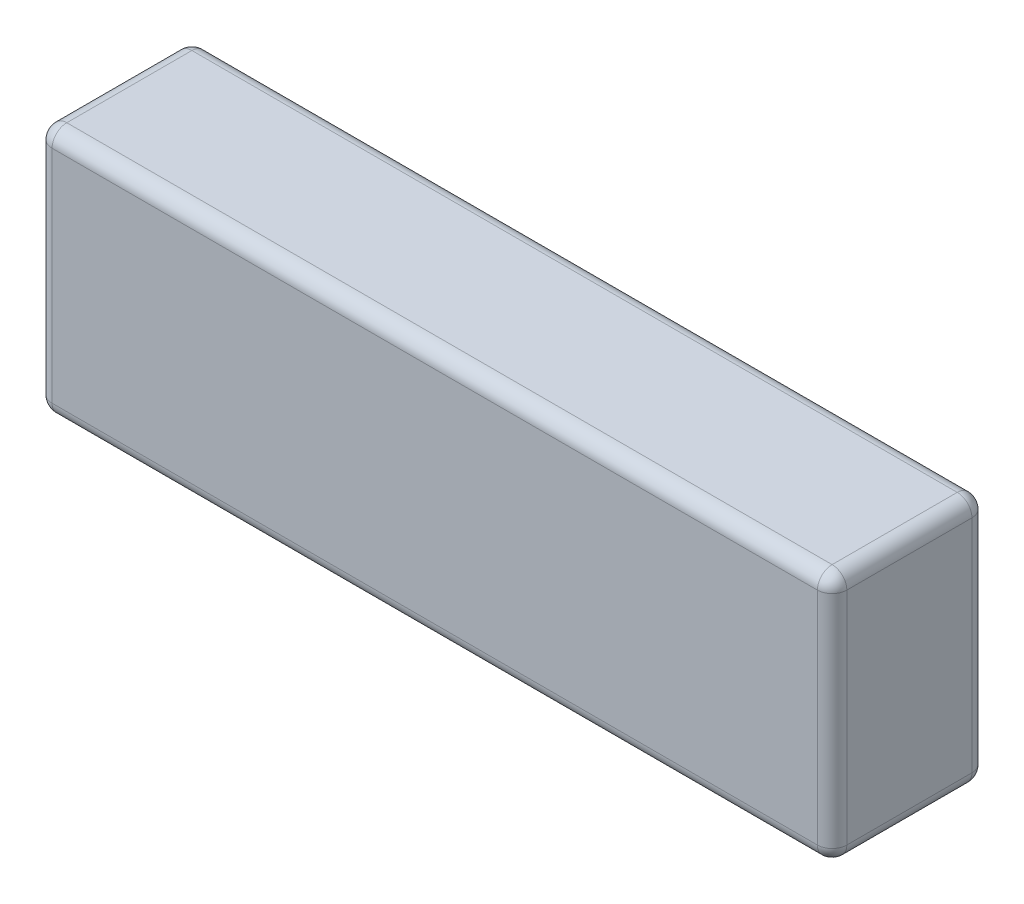
ISO-10303-21;
HEADER;
FILE_DESCRIPTION(('STEP AP214'),'2;1');
FILE_NAME('part.step','',(''),(''),'','','');
FILE_SCHEMA(('AUTOMOTIVE_DESIGN { 1 0 10303 214 1 1 1 1 }'));
ENDSEC;
DATA;
#1=APPLICATION_CONTEXT('core data for automotive mechanical design processes');
#2=APPLICATION_PROTOCOL_DEFINITION('international standard','automotive_design',2000,#1);
#3=PRODUCT_CONTEXT('',#1,'mechanical');
#4=PRODUCT('Part','Part','',(#3));
#5=PRODUCT_RELATED_PRODUCT_CATEGORY('part','',(#4));
#6=PRODUCT_DEFINITION_FORMATION('','',#4);
#7=PRODUCT_DEFINITION_CONTEXT('part definition',#1,'design');
#8=PRODUCT_DEFINITION('design','',#6,#7);
#9=PRODUCT_DEFINITION_SHAPE('','',#8);
#10=(LENGTH_UNIT() NAMED_UNIT(*) SI_UNIT(.MILLI.,.METRE.));
#11=(NAMED_UNIT(*) PLANE_ANGLE_UNIT() SI_UNIT($,.RADIAN.));
#12=(NAMED_UNIT(*) SI_UNIT($,.STERADIAN.) SOLID_ANGLE_UNIT());
#13=UNCERTAINTY_MEASURE_WITH_UNIT(LENGTH_MEASURE(1.E-05),#10,'distance_accuracy_value','');
#14=(GEOMETRIC_REPRESENTATION_CONTEXT(3) GLOBAL_UNCERTAINTY_ASSIGNED_CONTEXT((#13)) GLOBAL_UNIT_ASSIGNED_CONTEXT((#10,
#11,#12)) REPRESENTATION_CONTEXT('',''));
#15=CARTESIAN_POINT('',(0.,0.,0.));
#16=DIRECTION('',(0.,0.,1.));
#17=DIRECTION('',(1.,0.,0.));
#18=AXIS2_PLACEMENT_3D('',#15,#16,#17);
#19=CARTESIAN_POINT('',(54.,-17.,21.));
#20=DIRECTION('',(-1.,0.,0.));
#21=DIRECTION('',(0.,0.,1.));
#22=AXIS2_PLACEMENT_3D('',#19,#20,#21);
#23=PLANE('',#22);
#24=DIRECTION('',(0.,1.,0.));
#25=VECTOR('',#24,1.);
#26=CARTESIAN_POINT('',(54.,17.,2.));
#27=LINE('',#26,#25);
#28=CARTESIAN_POINT('',(54.,-15.,2.));
#29=VERTEX_POINT('',#28);
#30=CARTESIAN_POINT('',(54.,15.,2.));
#31=VERTEX_POINT('',#30);
#32=EDGE_CURVE('E168',#29,#31,#27,.T.);
#33=ORIENTED_EDGE('',*,*,#32,.T.);
#34=DIRECTION('',(0.,0.,-1.));
#35=VECTOR('',#34,1.);
#36=CARTESIAN_POINT('',(54.,15.,21.));
#37=LINE('',#36,#35);
#38=CARTESIAN_POINT('',(54.,15.,19.));
#39=VERTEX_POINT('',#38);
#40=EDGE_CURVE('E170',#31,#39,#37,.F.);
#41=ORIENTED_EDGE('',*,*,#40,.T.);
#42=DIRECTION('',(0.,1.,0.));
#43=VECTOR('',#42,1.);
#44=CARTESIAN_POINT('',(54.,-17.,19.));
#45=LINE('',#44,#43);
#46=CARTESIAN_POINT('',(54.,-15.,19.));
#47=VERTEX_POINT('',#46);
#48=EDGE_CURVE('E164',#39,#47,#45,.F.);
#49=ORIENTED_EDGE('',*,*,#48,.T.);
#50=DIRECTION('',(0.,0.,-1.));
#51=VECTOR('',#50,1.);
#52=CARTESIAN_POINT('',(54.,-15.,21.));
#53=LINE('',#52,#51);
#54=EDGE_CURVE('E166',#47,#29,#53,.T.);
#55=ORIENTED_EDGE('',*,*,#54,.T.);
#56=EDGE_LOOP('',(#33,#41,#49,#55));
#57=FACE_BOUND('',#56,.T.);
#58=ADVANCED_FACE('F33',(#57),#23,.F.);
#59=CARTESIAN_POINT('',(-54.,17.,21.));
#60=DIRECTION('',(0.,-1.,0.));
#61=DIRECTION('',(0.,0.,-1.));
#62=AXIS2_PLACEMENT_3D('',#59,#60,#61);
#63=PLANE('',#62);
#64=DIRECTION('',(0.,0.,-1.));
#65=VECTOR('',#64,1.);
#66=CARTESIAN_POINT('',(52.,17.,21.));
#67=LINE('',#66,#65);
#68=CARTESIAN_POINT('',(52.,17.,19.));
#69=VERTEX_POINT('',#68);
#70=CARTESIAN_POINT('',(52.,17.,2.));
#71=VERTEX_POINT('',#70);
#72=EDGE_CURVE('E132',#69,#71,#67,.T.);
#73=ORIENTED_EDGE('',*,*,#72,.T.);
#74=DIRECTION('',(-1.,0.,0.));
#75=VECTOR('',#74,1.);
#76=CARTESIAN_POINT('',(-54.,17.,2.));
#77=LINE('',#76,#75);
#78=CARTESIAN_POINT('',(-52.,17.,2.));
#79=VERTEX_POINT('',#78);
#80=EDGE_CURVE('E128',#71,#79,#77,.T.);
#81=ORIENTED_EDGE('',*,*,#80,.T.);
#82=DIRECTION('',(0.,0.,-1.));
#83=VECTOR('',#82,1.);
#84=CARTESIAN_POINT('',(-52.,17.,21.));
#85=LINE('',#84,#83);
#86=CARTESIAN_POINT('',(-52.,17.,19.));
#87=VERTEX_POINT('',#86);
#88=EDGE_CURVE('E120',#79,#87,#85,.F.);
#89=ORIENTED_EDGE('',*,*,#88,.T.);
#90=DIRECTION('',(-1.,0.,0.));
#91=VECTOR('',#90,1.);
#92=CARTESIAN_POINT('',(-54.,17.,19.));
#93=LINE('',#92,#91);
#94=EDGE_CURVE('E125',#87,#69,#93,.F.);
#95=ORIENTED_EDGE('',*,*,#94,.T.);
#96=EDGE_LOOP('',(#73,#81,#89,#95));
#97=FACE_BOUND('',#96,.T.);
#98=ADVANCED_FACE('F123',(#97),#63,.F.);
#99=CARTESIAN_POINT('',(-54.,-17.,21.));
#100=DIRECTION('',(1.,0.,0.));
#101=DIRECTION('',(0.,0.,-1.));
#102=AXIS2_PLACEMENT_3D('',#99,#100,#101);
#103=PLANE('',#102);
#104=DIRECTION('',(0.,-1.,0.));
#105=VECTOR('',#104,1.);
#106=CARTESIAN_POINT('',(-54.,-17.,19.));
#107=LINE('',#106,#105);
#108=CARTESIAN_POINT('',(-54.,-15.,19.));
#109=VERTEX_POINT('',#108);
#110=CARTESIAN_POINT('',(-54.,15.,19.));
#111=VERTEX_POINT('',#110);
#112=EDGE_CURVE('E173',#109,#111,#107,.F.);
#113=ORIENTED_EDGE('',*,*,#112,.T.);
#114=DIRECTION('',(0.,0.,-1.));
#115=VECTOR('',#114,1.);
#116=CARTESIAN_POINT('',(-54.,15.,21.));
#117=LINE('',#116,#115);
#118=CARTESIAN_POINT('',(-54.,15.,2.));
#119=VERTEX_POINT('',#118);
#120=EDGE_CURVE('E140',#111,#119,#117,.T.);
#121=ORIENTED_EDGE('',*,*,#120,.T.);
#122=DIRECTION('',(0.,-1.,0.));
#123=VECTOR('',#122,1.);
#124=CARTESIAN_POINT('',(-54.,-17.,2.));
#125=LINE('',#124,#123);
#126=CARTESIAN_POINT('',(-54.,-15.,2.));
#127=VERTEX_POINT('',#126);
#128=EDGE_CURVE('E177',#119,#127,#125,.T.);
#129=ORIENTED_EDGE('',*,*,#128,.T.);
#130=DIRECTION('',(0.,0.,-1.));
#131=VECTOR('',#130,1.);
#132=CARTESIAN_POINT('',(-54.,-15.,21.));
#133=LINE('',#132,#131);
#134=EDGE_CURVE('E175',#127,#109,#133,.F.);
#135=ORIENTED_EDGE('',*,*,#134,.T.);
#136=EDGE_LOOP('',(#113,#121,#129,#135));
#137=FACE_BOUND('',#136,.T.);
#138=ADVANCED_FACE('F324',(#137),#103,.F.);
#139=CARTESIAN_POINT('',(-54.,-17.,21.));
#140=DIRECTION('',(0.,1.,0.));
#141=DIRECTION('',(0.,0.,1.));
#142=AXIS2_PLACEMENT_3D('',#139,#140,#141);
#143=PLANE('',#142);
#144=DIRECTION('',(0.,0.,-1.));
#145=VECTOR('',#144,1.);
#146=CARTESIAN_POINT('',(-52.,-17.,21.));
#147=LINE('',#146,#145);
#148=CARTESIAN_POINT('',(-52.,-17.,19.));
#149=VERTEX_POINT('',#148);
#150=CARTESIAN_POINT('',(-52.,-17.,2.));
#151=VERTEX_POINT('',#150);
#152=EDGE_CURVE('E193',#149,#151,#147,.T.);
#153=ORIENTED_EDGE('',*,*,#152,.T.);
#154=DIRECTION('',(1.,0.,0.));
#155=VECTOR('',#154,1.);
#156=CARTESIAN_POINT('',(54.,-17.,2.));
#157=LINE('',#156,#155);
#158=CARTESIAN_POINT('',(52.,-17.,2.));
#159=VERTEX_POINT('',#158);
#160=EDGE_CURVE('E196',#151,#159,#157,.T.);
#161=ORIENTED_EDGE('',*,*,#160,.T.);
#162=DIRECTION('',(0.,0.,-1.));
#163=VECTOR('',#162,1.);
#164=CARTESIAN_POINT('',(52.,-17.,21.));
#165=LINE('',#164,#163);
#166=CARTESIAN_POINT('',(52.,-17.,19.));
#167=VERTEX_POINT('',#166);
#168=EDGE_CURVE('E191',#159,#167,#165,.F.);
#169=ORIENTED_EDGE('',*,*,#168,.T.);
#170=DIRECTION('',(1.,0.,0.));
#171=VECTOR('',#170,1.);
#172=CARTESIAN_POINT('',(-54.,-17.,19.));
#173=LINE('',#172,#171);
#174=EDGE_CURVE('E189',#167,#149,#173,.F.);
#175=ORIENTED_EDGE('',*,*,#174,.T.);
#176=EDGE_LOOP('',(#153,#161,#169,#175));
#177=FACE_BOUND('',#176,.T.);
#178=ADVANCED_FACE('F273',(#177),#143,.F.);
#179=CARTESIAN_POINT('',(0.,0.,21.));
#180=DIRECTION('',(0.,0.,-1.));
#181=DIRECTION('',(-1.,0.,0.));
#182=AXIS2_PLACEMENT_3D('',#179,#180,#181);
#183=PLANE('',#182);
#184=DIRECTION('',(0.,-1.,0.));
#185=VECTOR('',#184,1.);
#186=CARTESIAN_POINT('',(-52.,0.,21.));
#187=LINE('',#186,#185);
#188=CARTESIAN_POINT('',(-52.,15.,21.));
#189=VERTEX_POINT('',#188);
#190=CARTESIAN_POINT('',(-52.,-15.,21.));
#191=VERTEX_POINT('',#190);
#192=EDGE_CURVE('E42',#189,#191,#187,.T.);
#193=ORIENTED_EDGE('',*,*,#192,.T.);
#194=DIRECTION('',(1.,0.,0.));
#195=VECTOR('',#194,1.);
#196=CARTESIAN_POINT('',(0.,-15.,21.));
#197=LINE('',#196,#195);
#198=CARTESIAN_POINT('',(52.,-15.,21.));
#199=VERTEX_POINT('',#198);
#200=EDGE_CURVE('E11',#191,#199,#197,.T.);
#201=ORIENTED_EDGE('',*,*,#200,.T.);
#202=DIRECTION('',(0.,1.,0.));
#203=VECTOR('',#202,1.);
#204=CARTESIAN_POINT('',(52.,0.,21.));
#205=LINE('',#204,#203);
#206=CARTESIAN_POINT('',(52.,15.,21.));
#207=VERTEX_POINT('',#206);
#208=EDGE_CURVE('E198',#199,#207,#205,.T.);
#209=ORIENTED_EDGE('',*,*,#208,.T.);
#210=DIRECTION('',(-1.,0.,0.));
#211=VECTOR('',#210,1.);
#212=CARTESIAN_POINT('',(0.,15.,21.));
#213=LINE('',#212,#211);
#214=EDGE_CURVE('E53',#207,#189,#213,.T.);
#215=ORIENTED_EDGE('',*,*,#214,.T.);
#216=EDGE_LOOP('',(#193,#201,#209,#215));
#217=FACE_BOUND('',#216,.T.);
#218=ADVANCED_FACE('F288',(#217),#183,.F.);
#219=CARTESIAN_POINT('',(0.,0.,0.));
#220=DIRECTION('',(0.,0.,-1.));
#221=DIRECTION('',(-1.,0.,0.));
#222=AXIS2_PLACEMENT_3D('',#219,#220,#221);
#223=PLANE('',#222);
#224=DIRECTION('',(0.,-1.,0.));
#225=VECTOR('',#224,1.);
#226=CARTESIAN_POINT('',(-52.,17.,0.));
#227=LINE('',#226,#225);
#228=CARTESIAN_POINT('',(-52.,-15.,0.));
#229=VERTEX_POINT('',#228);
#230=CARTESIAN_POINT('',(-52.,15.,0.));
#231=VERTEX_POINT('',#230);
#232=EDGE_CURVE('E184',#229,#231,#227,.F.);
#233=ORIENTED_EDGE('',*,*,#232,.T.);
#234=DIRECTION('',(-1.,0.,0.));
#235=VECTOR('',#234,1.);
#236=CARTESIAN_POINT('',(54.,15.,0.));
#237=LINE('',#236,#235);
#238=CARTESIAN_POINT('',(52.,15.,0.));
#239=VERTEX_POINT('',#238);
#240=EDGE_CURVE('E186',#231,#239,#237,.F.);
#241=ORIENTED_EDGE('',*,*,#240,.T.);
#242=DIRECTION('',(0.,1.,0.));
#243=VECTOR('',#242,1.);
#244=CARTESIAN_POINT('',(52.,-17.,0.));
#245=LINE('',#244,#243);
#246=CARTESIAN_POINT('',(52.,-15.,0.));
#247=VERTEX_POINT('',#246);
#248=EDGE_CURVE('E182',#239,#247,#245,.F.);
#249=ORIENTED_EDGE('',*,*,#248,.T.);
#250=DIRECTION('',(1.,0.,0.));
#251=VECTOR('',#250,1.);
#252=CARTESIAN_POINT('',(-54.,-15.,0.));
#253=LINE('',#252,#251);
#254=EDGE_CURVE('E180',#247,#229,#253,.F.);
#255=ORIENTED_EDGE('',*,*,#254,.T.);
#256=EDGE_LOOP('',(#233,#241,#249,#255));
#257=FACE_BOUND('',#256,.T.);
#258=ADVANCED_FACE('F264',(#257),#223,.T.);
#259=CARTESIAN_POINT('',(-52.,-15.,21.));
#260=DIRECTION('',(0.,0.,-1.));
#261=DIRECTION('',(-1.,0.,0.));
#262=AXIS2_PLACEMENT_3D('',#259,#260,#261);
#263=CYLINDRICAL_SURFACE('',#262,2.);
#264=CARTESIAN_POINT('',(-52.,-15.,19.));
#265=DIRECTION('',(0.,0.,1.));
#266=DIRECTION('',(1.,0.,0.));
#267=AXIS2_PLACEMENT_3D('',#264,#265,#266);
#268=CIRCLE('',#267,2.);
#269=EDGE_CURVE('E37',#109,#149,#268,.T.);
#270=ORIENTED_EDGE('',*,*,#269,.F.);
#271=ORIENTED_EDGE('',*,*,#134,.F.);
#272=CARTESIAN_POINT('',(-52.,-15.,2.));
#273=DIRECTION('',(0.,0.,-1.));
#274=DIRECTION('',(-1.,0.,0.));
#275=AXIS2_PLACEMENT_3D('',#272,#273,#274);
#276=CIRCLE('',#275,2.);
#277=EDGE_CURVE('E160',#151,#127,#276,.T.);
#278=ORIENTED_EDGE('',*,*,#277,.F.);
#279=ORIENTED_EDGE('',*,*,#152,.F.);
#280=EDGE_LOOP('',(#270,#271,#278,#279));
#281=FACE_BOUND('',#280,.T.);
#282=ADVANCED_FACE('F35',(#281),#263,.T.);
#283=CARTESIAN_POINT('',(-52.,-15.,19.));
#284=DIRECTION('',(0.,0.,1.));
#285=DIRECTION('',(1.,0.,0.));
#286=AXIS2_PLACEMENT_3D('',#283,#284,#285);
#287=SPHERICAL_SURFACE('',#286,2.);
#288=CARTESIAN_POINT('',(-52.,-15.,19.));
#289=DIRECTION('',(0.,-1.,0.));
#290=DIRECTION('',(0.,0.,-1.));
#291=AXIS2_PLACEMENT_3D('',#288,#289,#290);
#292=CIRCLE('',#291,2.);
#293=EDGE_CURVE('E244',#109,#191,#292,.F.);
#294=ORIENTED_EDGE('',*,*,#293,.F.);
#295=ORIENTED_EDGE('',*,*,#269,.T.);
#296=CARTESIAN_POINT('',(-52.,-15.,19.));
#297=DIRECTION('',(-1.,0.,0.));
#298=DIRECTION('',(0.,0.,1.));
#299=AXIS2_PLACEMENT_3D('',#296,#297,#298);
#300=CIRCLE('',#299,2.);
#301=EDGE_CURVE('E246',#191,#149,#300,.F.);
#302=ORIENTED_EDGE('',*,*,#301,.F.);
#303=EDGE_LOOP('',(#294,#295,#302));
#304=FACE_BOUND('',#303,.T.);
#305=ADVANCED_FACE('F457',(#304),#287,.T.);
#306=CARTESIAN_POINT('',(-52.,-15.,2.));
#307=DIRECTION('',(0.,0.,1.));
#308=DIRECTION('',(1.,0.,0.));
#309=AXIS2_PLACEMENT_3D('',#306,#307,#308);
#310=SPHERICAL_SURFACE('',#309,2.);
#311=CARTESIAN_POINT('',(-52.,-15.,2.));
#312=DIRECTION('',(-1.,0.,0.));
#313=DIRECTION('',(0.,0.,1.));
#314=AXIS2_PLACEMENT_3D('',#311,#312,#313);
#315=CIRCLE('',#314,2.);
#316=EDGE_CURVE('E238',#151,#229,#315,.F.);
#317=ORIENTED_EDGE('',*,*,#316,.F.);
#318=ORIENTED_EDGE('',*,*,#277,.T.);
#319=CARTESIAN_POINT('',(-52.,-15.,2.));
#320=DIRECTION('',(0.,-1.,0.));
#321=DIRECTION('',(0.,0.,-1.));
#322=AXIS2_PLACEMENT_3D('',#319,#320,#321);
#323=CIRCLE('',#322,2.);
#324=EDGE_CURVE('E241',#229,#127,#323,.F.);
#325=ORIENTED_EDGE('',*,*,#324,.F.);
#326=EDGE_LOOP('',(#317,#318,#325));
#327=FACE_BOUND('',#326,.T.);
#328=ADVANCED_FACE('F253',(#327),#310,.T.);
#329=CARTESIAN_POINT('',(0.,-15.,19.));
#330=DIRECTION('',(1.,0.,0.));
#331=DIRECTION('',(0.,0.,-1.));
#332=AXIS2_PLACEMENT_3D('',#329,#330,#331);
#333=CYLINDRICAL_SURFACE('',#332,2.);
#334=ORIENTED_EDGE('',*,*,#301,.T.);
#335=ORIENTED_EDGE('',*,*,#174,.F.);
#336=CARTESIAN_POINT('',(52.,-15.,19.));
#337=DIRECTION('',(1.,0.,0.));
#338=DIRECTION('',(0.,0.,-1.));
#339=AXIS2_PLACEMENT_3D('',#336,#337,#338);
#340=CIRCLE('',#339,2.);
#341=EDGE_CURVE('E232',#199,#167,#340,.T.);
#342=ORIENTED_EDGE('',*,*,#341,.F.);
#343=ORIENTED_EDGE('',*,*,#200,.F.);
#344=EDGE_LOOP('',(#334,#335,#342,#343));
#345=FACE_BOUND('',#344,.T.);
#346=ADVANCED_FACE('F287',(#345),#333,.T.);
#347=CARTESIAN_POINT('',(-52.,0.,19.));
#348=DIRECTION('',(0.,-1.,0.));
#349=DIRECTION('',(0.,0.,-1.));
#350=AXIS2_PLACEMENT_3D('',#347,#348,#349);
#351=CYLINDRICAL_SURFACE('',#350,2.);
#352=ORIENTED_EDGE('',*,*,#293,.T.);
#353=ORIENTED_EDGE('',*,*,#192,.F.);
#354=CARTESIAN_POINT('',(-52.,15.,19.));
#355=DIRECTION('',(0.,1.,0.));
#356=DIRECTION('',(0.,0.,1.));
#357=AXIS2_PLACEMENT_3D('',#354,#355,#356);
#358=CIRCLE('',#357,2.);
#359=EDGE_CURVE('E144',#111,#189,#358,.T.);
#360=ORIENTED_EDGE('',*,*,#359,.F.);
#361=ORIENTED_EDGE('',*,*,#112,.F.);
#362=EDGE_LOOP('',(#352,#353,#360,#361));
#363=FACE_BOUND('',#362,.T.);
#364=ADVANCED_FACE('F434',(#363),#351,.T.);
#365=CARTESIAN_POINT('',(-52.,15.,21.));
#366=DIRECTION('',(0.,0.,-1.));
#367=DIRECTION('',(-1.,0.,0.));
#368=AXIS2_PLACEMENT_3D('',#365,#366,#367);
#369=CYLINDRICAL_SURFACE('',#368,2.);
#370=CARTESIAN_POINT('',(-52.,15.,2.));
#371=DIRECTION('',(0.,0.,-1.));
#372=DIRECTION('',(-1.,0.,0.));
#373=AXIS2_PLACEMENT_3D('',#370,#371,#372);
#374=CIRCLE('',#373,2.);
#375=EDGE_CURVE('E145',#119,#79,#374,.T.);
#376=ORIENTED_EDGE('',*,*,#375,.F.);
#377=ORIENTED_EDGE('',*,*,#120,.F.);
#378=CARTESIAN_POINT('',(-52.,15.,19.));
#379=DIRECTION('',(0.,0.,1.));
#380=DIRECTION('',(1.,0.,0.));
#381=AXIS2_PLACEMENT_3D('',#378,#379,#380);
#382=CIRCLE('',#381,2.);
#383=EDGE_CURVE('E136',#87,#111,#382,.T.);
#384=ORIENTED_EDGE('',*,*,#383,.F.);
#385=ORIENTED_EDGE('',*,*,#88,.F.);
#386=EDGE_LOOP('',(#376,#377,#384,#385));
#387=FACE_BOUND('',#386,.T.);
#388=ADVANCED_FACE('F138',(#387),#369,.T.);
#389=CARTESIAN_POINT('',(-52.,-17.,2.));
#390=DIRECTION('',(0.,1.,0.));
#391=DIRECTION('',(0.,0.,1.));
#392=AXIS2_PLACEMENT_3D('',#389,#390,#391);
#393=CYLINDRICAL_SURFACE('',#392,2.);
#394=ORIENTED_EDGE('',*,*,#324,.T.);
#395=ORIENTED_EDGE('',*,*,#128,.F.);
#396=CARTESIAN_POINT('',(-52.,15.,2.));
#397=DIRECTION('',(0.,1.,0.));
#398=DIRECTION('',(-1.,0.,0.));
#399=AXIS2_PLACEMENT_3D('',#396,#397,#398);
#400=CIRCLE('',#399,2.);
#401=EDGE_CURVE('E228',#231,#119,#400,.T.);
#402=ORIENTED_EDGE('',*,*,#401,.F.);
#403=ORIENTED_EDGE('',*,*,#232,.F.);
#404=EDGE_LOOP('',(#394,#395,#402,#403));
#405=FACE_BOUND('',#404,.T.);
#406=ADVANCED_FACE('F260',(#405),#393,.T.);
#407=CARTESIAN_POINT('',(-54.,-15.,2.));
#408=DIRECTION('',(-1.,0.,0.));
#409=DIRECTION('',(0.,0.,1.));
#410=AXIS2_PLACEMENT_3D('',#407,#408,#409);
#411=CYLINDRICAL_SURFACE('',#410,2.);
#412=ORIENTED_EDGE('',*,*,#316,.T.);
#413=ORIENTED_EDGE('',*,*,#254,.F.);
#414=CARTESIAN_POINT('',(52.,-15.,2.));
#415=DIRECTION('',(1.,0.,0.));
#416=DIRECTION('',(0.,0.,-1.));
#417=AXIS2_PLACEMENT_3D('',#414,#415,#416);
#418=CIRCLE('',#417,2.);
#419=EDGE_CURVE('E225',#159,#247,#418,.T.);
#420=ORIENTED_EDGE('',*,*,#419,.F.);
#421=ORIENTED_EDGE('',*,*,#160,.F.);
#422=EDGE_LOOP('',(#412,#413,#420,#421));
#423=FACE_BOUND('',#422,.T.);
#424=ADVANCED_FACE('F270',(#423),#411,.T.);
#425=CARTESIAN_POINT('',(52.,-15.,21.));
#426=DIRECTION('',(0.,0.,-1.));
#427=DIRECTION('',(-1.,0.,0.));
#428=AXIS2_PLACEMENT_3D('',#425,#426,#427);
#429=CYLINDRICAL_SURFACE('',#428,2.);
#430=CARTESIAN_POINT('',(52.,-15.,19.));
#431=DIRECTION('',(0.,0.,1.));
#432=DIRECTION('',(1.,0.,0.));
#433=AXIS2_PLACEMENT_3D('',#430,#431,#432);
#434=CIRCLE('',#433,2.);
#435=EDGE_CURVE('E235',#167,#47,#434,.T.);
#436=ORIENTED_EDGE('',*,*,#435,.F.);
#437=ORIENTED_EDGE('',*,*,#168,.F.);
#438=CARTESIAN_POINT('',(52.,-15.,2.));
#439=DIRECTION('',(0.,0.,-1.));
#440=DIRECTION('',(-1.,0.,0.));
#441=AXIS2_PLACEMENT_3D('',#438,#439,#440);
#442=CIRCLE('',#441,2.);
#443=EDGE_CURVE('E222',#29,#159,#442,.T.);
#444=ORIENTED_EDGE('',*,*,#443,.F.);
#445=ORIENTED_EDGE('',*,*,#54,.F.);
#446=EDGE_LOOP('',(#436,#437,#444,#445));
#447=FACE_BOUND('',#446,.T.);
#448=ADVANCED_FACE('F278',(#447),#429,.T.);
#449=CARTESIAN_POINT('',(52.,-15.,19.));
#450=DIRECTION('',(0.,0.,1.));
#451=DIRECTION('',(1.,0.,0.));
#452=AXIS2_PLACEMENT_3D('',#449,#450,#451);
#453=SPHERICAL_SURFACE('',#452,2.);
#454=ORIENTED_EDGE('',*,*,#341,.T.);
#455=ORIENTED_EDGE('',*,*,#435,.T.);
#456=CARTESIAN_POINT('',(52.,-15.,19.));
#457=DIRECTION('',(0.,-1.,0.));
#458=DIRECTION('',(0.,0.,-1.));
#459=AXIS2_PLACEMENT_3D('',#456,#457,#458);
#460=CIRCLE('',#459,2.);
#461=EDGE_CURVE('E151',#199,#47,#460,.F.);
#462=ORIENTED_EDGE('',*,*,#461,.F.);
#463=EDGE_LOOP('',(#454,#455,#462));
#464=FACE_BOUND('',#463,.T.);
#465=ADVANCED_FACE('F284',(#464),#453,.T.);
#466=CARTESIAN_POINT('',(-52.,15.,19.));
#467=DIRECTION('',(0.,0.,1.));
#468=DIRECTION('',(1.,0.,0.));
#469=AXIS2_PLACEMENT_3D('',#466,#467,#468);
#470=SPHERICAL_SURFACE('',#469,2.);
#471=ORIENTED_EDGE('',*,*,#383,.T.);
#472=ORIENTED_EDGE('',*,*,#359,.T.);
#473=CARTESIAN_POINT('',(-52.,15.,19.));
#474=DIRECTION('',(-1.,0.,0.));
#475=DIRECTION('',(0.,0.,1.));
#476=AXIS2_PLACEMENT_3D('',#473,#474,#475);
#477=CIRCLE('',#476,2.);
#478=EDGE_CURVE('E148',#87,#189,#477,.F.);
#479=ORIENTED_EDGE('',*,*,#478,.F.);
#480=EDGE_LOOP('',(#471,#472,#479));
#481=FACE_BOUND('',#480,.T.);
#482=ADVANCED_FACE('F149',(#481),#470,.T.);
#483=CARTESIAN_POINT('',(-52.,15.,2.));
#484=DIRECTION('',(0.,0.,1.));
#485=DIRECTION('',(1.,0.,0.));
#486=AXIS2_PLACEMENT_3D('',#483,#484,#485);
#487=SPHERICAL_SURFACE('',#486,2.);
#488=ORIENTED_EDGE('',*,*,#401,.T.);
#489=ORIENTED_EDGE('',*,*,#375,.T.);
#490=CARTESIAN_POINT('',(-52.,15.,2.));
#491=DIRECTION('',(-1.,0.,0.));
#492=DIRECTION('',(0.,0.,1.));
#493=AXIS2_PLACEMENT_3D('',#490,#491,#492);
#494=CIRCLE('',#493,2.);
#495=EDGE_CURVE('E152',#231,#79,#494,.F.);
#496=ORIENTED_EDGE('',*,*,#495,.F.);
#497=EDGE_LOOP('',(#488,#489,#496));
#498=FACE_BOUND('',#497,.T.);
#499=ADVANCED_FACE('F307',(#498),#487,.T.);
#500=CARTESIAN_POINT('',(52.,-15.,2.));
#501=DIRECTION('',(0.,0.,1.));
#502=DIRECTION('',(1.,0.,0.));
#503=AXIS2_PLACEMENT_3D('',#500,#501,#502);
#504=SPHERICAL_SURFACE('',#503,2.);
#505=ORIENTED_EDGE('',*,*,#443,.T.);
#506=ORIENTED_EDGE('',*,*,#419,.T.);
#507=CARTESIAN_POINT('',(52.,-15.,2.));
#508=DIRECTION('',(0.,-1.,0.));
#509=DIRECTION('',(0.,0.,-1.));
#510=AXIS2_PLACEMENT_3D('',#507,#508,#509);
#511=CIRCLE('',#510,2.);
#512=EDGE_CURVE('E215',#29,#247,#511,.F.);
#513=ORIENTED_EDGE('',*,*,#512,.F.);
#514=EDGE_LOOP('',(#505,#506,#513));
#515=FACE_BOUND('',#514,.T.);
#516=ADVANCED_FACE('F309',(#515),#504,.T.);
#517=CARTESIAN_POINT('',(52.,0.,19.));
#518=DIRECTION('',(0.,1.,0.));
#519=DIRECTION('',(0.,0.,1.));
#520=AXIS2_PLACEMENT_3D('',#517,#518,#519);
#521=CYLINDRICAL_SURFACE('',#520,2.);
#522=ORIENTED_EDGE('',*,*,#461,.T.);
#523=ORIENTED_EDGE('',*,*,#48,.F.);
#524=CARTESIAN_POINT('',(52.,15.,19.));
#525=DIRECTION('',(0.,1.,0.));
#526=DIRECTION('',(0.,0.,1.));
#527=AXIS2_PLACEMENT_3D('',#524,#525,#526);
#528=CIRCLE('',#527,2.);
#529=EDGE_CURVE('E212',#207,#39,#528,.T.);
#530=ORIENTED_EDGE('',*,*,#529,.F.);
#531=ORIENTED_EDGE('',*,*,#208,.F.);
#532=EDGE_LOOP('',(#522,#523,#530,#531));
#533=FACE_BOUND('',#532,.T.);
#534=ADVANCED_FACE('F292',(#533),#521,.T.);
#535=CARTESIAN_POINT('',(0.,15.,19.));
#536=DIRECTION('',(-1.,0.,0.));
#537=DIRECTION('',(0.,0.,1.));
#538=AXIS2_PLACEMENT_3D('',#535,#536,#537);
#539=CYLINDRICAL_SURFACE('',#538,2.);
#540=ORIENTED_EDGE('',*,*,#478,.T.);
#541=ORIENTED_EDGE('',*,*,#214,.F.);
#542=CARTESIAN_POINT('',(52.,15.,19.));
#543=DIRECTION('',(1.,0.,0.));
#544=DIRECTION('',(0.,0.,-1.));
#545=AXIS2_PLACEMENT_3D('',#542,#543,#544);
#546=CIRCLE('',#545,2.);
#547=EDGE_CURVE('E156',#69,#207,#546,.T.);
#548=ORIENTED_EDGE('',*,*,#547,.F.);
#549=ORIENTED_EDGE('',*,*,#94,.F.);
#550=EDGE_LOOP('',(#540,#541,#548,#549));
#551=FACE_BOUND('',#550,.T.);
#552=ADVANCED_FACE('F154',(#551),#539,.T.);
#553=CARTESIAN_POINT('',(-54.,15.,2.));
#554=DIRECTION('',(1.,0.,0.));
#555=DIRECTION('',(0.,0.,-1.));
#556=AXIS2_PLACEMENT_3D('',#553,#554,#555);
#557=CYLINDRICAL_SURFACE('',#556,2.);
#558=ORIENTED_EDGE('',*,*,#495,.T.);
#559=ORIENTED_EDGE('',*,*,#80,.F.);
#560=CARTESIAN_POINT('',(52.,15.,2.));
#561=DIRECTION('',(1.,0.,0.));
#562=DIRECTION('',(0.,0.,-1.));
#563=AXIS2_PLACEMENT_3D('',#560,#561,#562);
#564=CIRCLE('',#563,2.);
#565=EDGE_CURVE('E208',#239,#71,#564,.T.);
#566=ORIENTED_EDGE('',*,*,#565,.F.);
#567=ORIENTED_EDGE('',*,*,#240,.F.);
#568=EDGE_LOOP('',(#558,#559,#566,#567));
#569=FACE_BOUND('',#568,.T.);
#570=ADVANCED_FACE('F305',(#569),#557,.T.);
#571=CARTESIAN_POINT('',(52.,-17.,2.));
#572=DIRECTION('',(0.,-1.,0.));
#573=DIRECTION('',(0.,0.,-1.));
#574=AXIS2_PLACEMENT_3D('',#571,#572,#573);
#575=CYLINDRICAL_SURFACE('',#574,2.);
#576=ORIENTED_EDGE('',*,*,#512,.T.);
#577=ORIENTED_EDGE('',*,*,#248,.F.);
#578=CARTESIAN_POINT('',(52.,15.,2.));
#579=DIRECTION('',(0.,1.,0.));
#580=DIRECTION('',(0.,0.,1.));
#581=AXIS2_PLACEMENT_3D('',#578,#579,#580);
#582=CIRCLE('',#581,2.);
#583=EDGE_CURVE('E206',#31,#239,#582,.T.);
#584=ORIENTED_EDGE('',*,*,#583,.F.);
#585=ORIENTED_EDGE('',*,*,#32,.F.);
#586=EDGE_LOOP('',(#576,#577,#584,#585));
#587=FACE_BOUND('',#586,.T.);
#588=ADVANCED_FACE('F334',(#587),#575,.T.);
#589=CARTESIAN_POINT('',(52.,15.,19.));
#590=DIRECTION('',(0.,0.,1.));
#591=DIRECTION('',(1.,0.,0.));
#592=AXIS2_PLACEMENT_3D('',#589,#590,#591);
#593=SPHERICAL_SURFACE('',#592,2.);
#594=ORIENTED_EDGE('',*,*,#547,.T.);
#595=ORIENTED_EDGE('',*,*,#529,.T.);
#596=CARTESIAN_POINT('',(52.,15.,19.));
#597=DIRECTION('',(0.,0.,1.));
#598=DIRECTION('',(1.,0.,0.));
#599=AXIS2_PLACEMENT_3D('',#596,#597,#598);
#600=CIRCLE('',#599,2.);
#601=EDGE_CURVE('E204',#69,#39,#600,.F.);
#602=ORIENTED_EDGE('',*,*,#601,.F.);
#603=EDGE_LOOP('',(#594,#595,#602));
#604=FACE_BOUND('',#603,.T.);
#605=ADVANCED_FACE('F294',(#604),#593,.T.);
#606=CARTESIAN_POINT('',(52.,15.,2.));
#607=DIRECTION('',(0.,0.,1.));
#608=DIRECTION('',(1.,0.,0.));
#609=AXIS2_PLACEMENT_3D('',#606,#607,#608);
#610=SPHERICAL_SURFACE('',#609,2.);
#611=ORIENTED_EDGE('',*,*,#583,.T.);
#612=ORIENTED_EDGE('',*,*,#565,.T.);
#613=CARTESIAN_POINT('',(52.,15.,2.));
#614=DIRECTION('',(0.,0.,-1.));
#615=DIRECTION('',(-1.,0.,0.));
#616=AXIS2_PLACEMENT_3D('',#613,#614,#615);
#617=CIRCLE('',#616,2.);
#618=EDGE_CURVE('E202',#31,#71,#617,.F.);
#619=ORIENTED_EDGE('',*,*,#618,.F.);
#620=EDGE_LOOP('',(#611,#612,#619));
#621=FACE_BOUND('',#620,.T.);
#622=ADVANCED_FACE('F302',(#621),#610,.T.);
#623=CARTESIAN_POINT('',(52.,15.,21.));
#624=DIRECTION('',(0.,0.,-1.));
#625=DIRECTION('',(-1.,0.,0.));
#626=AXIS2_PLACEMENT_3D('',#623,#624,#625);
#627=CYLINDRICAL_SURFACE('',#626,2.);
#628=ORIENTED_EDGE('',*,*,#601,.T.);
#629=ORIENTED_EDGE('',*,*,#40,.F.);
#630=ORIENTED_EDGE('',*,*,#618,.T.);
#631=ORIENTED_EDGE('',*,*,#72,.F.);
#632=EDGE_LOOP('',(#628,#629,#630,#631));
#633=FACE_BOUND('',#632,.T.);
#634=ADVANCED_FACE('F298',(#633),#627,.T.);
#635=CLOSED_SHELL('',(#58,#98,#138,#178,#218,#258,#282,#305,#328,#346,#364,#388,#406,#424,#448,
#465,#482,#499,#516,#534,#552,#570,#588,#605,#622,#634));
#636=MANIFOLD_SOLID_BREP('B2',#635);
#637=ADVANCED_BREP_SHAPE_REPRESENTATION('',(#18,#636),#14);
#638=SHAPE_DEFINITION_REPRESENTATION(#9,#637);
ENDSEC;
END-ISO-10303-21;
